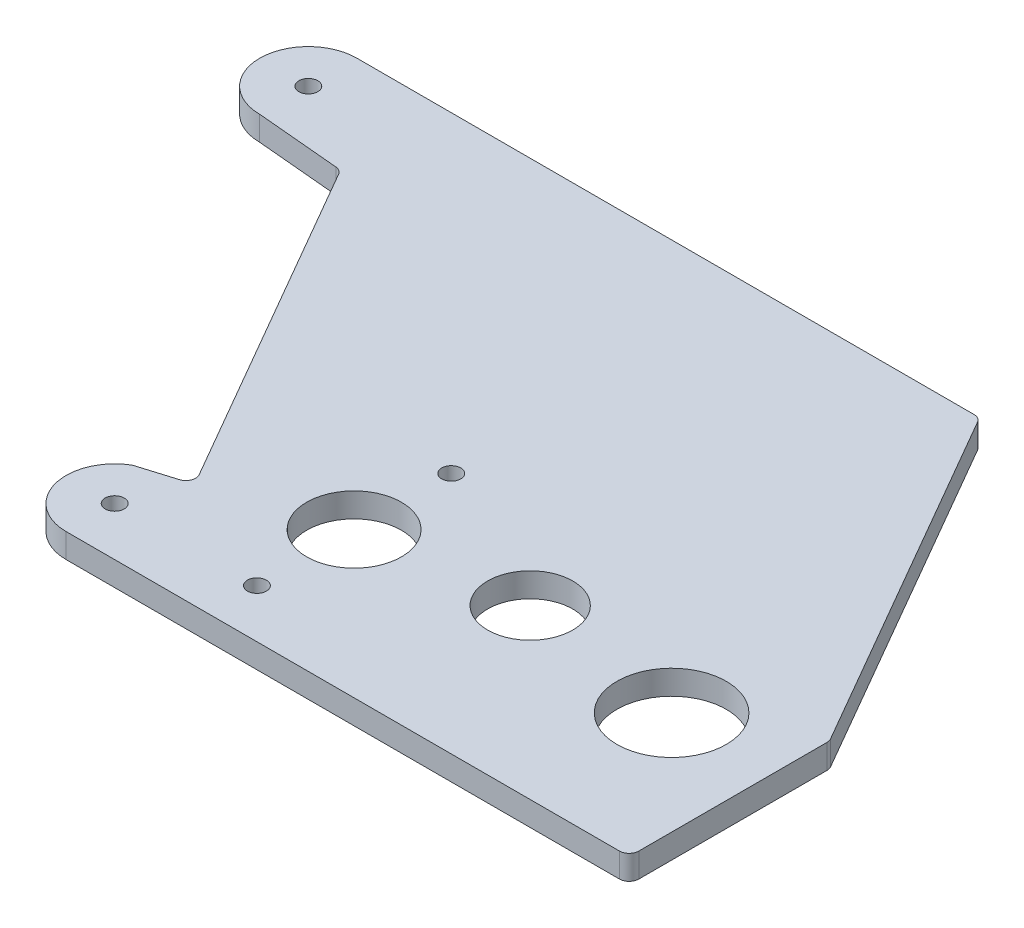
ISO-10303-21;
HEADER;
FILE_DESCRIPTION(('STEP AP214'),'2;1');
FILE_NAME('part.step','',(''),(''),'','','');
FILE_SCHEMA(('AUTOMOTIVE_DESIGN { 1 0 10303 214 1 1 1 1 }'));
ENDSEC;
DATA;
#1=APPLICATION_CONTEXT('core data for automotive mechanical design processes');
#2=APPLICATION_PROTOCOL_DEFINITION('international standard','automotive_design',2000,#1);
#3=PRODUCT_CONTEXT('',#1,'mechanical');
#4=PRODUCT('Part','Part','',(#3));
#5=PRODUCT_RELATED_PRODUCT_CATEGORY('part','',(#4));
#6=PRODUCT_DEFINITION_FORMATION('','',#4);
#7=PRODUCT_DEFINITION_CONTEXT('part definition',#1,'design');
#8=PRODUCT_DEFINITION('design','',#6,#7);
#9=PRODUCT_DEFINITION_SHAPE('','',#8);
#10=(LENGTH_UNIT() NAMED_UNIT(*) SI_UNIT(.MILLI.,.METRE.));
#11=(NAMED_UNIT(*) PLANE_ANGLE_UNIT() SI_UNIT($,.RADIAN.));
#12=(NAMED_UNIT(*) SI_UNIT($,.STERADIAN.) SOLID_ANGLE_UNIT());
#13=UNCERTAINTY_MEASURE_WITH_UNIT(LENGTH_MEASURE(1.E-05),#10,'distance_accuracy_value','');
#14=(GEOMETRIC_REPRESENTATION_CONTEXT(3) GLOBAL_UNCERTAINTY_ASSIGNED_CONTEXT((#13)) GLOBAL_UNIT_ASSIGNED_CONTEXT((#10,
#11,#12)) REPRESENTATION_CONTEXT('',''));
#15=CARTESIAN_POINT('',(0.,0.,0.));
#16=DIRECTION('',(0.,0.,1.));
#17=DIRECTION('',(1.,0.,0.));
#18=AXIS2_PLACEMENT_3D('',#15,#16,#17);
#19=CARTESIAN_POINT('',(4.6315098989881,6.35,15.2100282546714));
#20=DIRECTION('',(-0.291298086746578,0.,-0.956632335151694));
#21=DIRECTION('',(-0.956632335151694,0.,0.291298086746578));
#22=AXIS2_PLACEMENT_3D('',#19,#20,#21);
#23=PLANE('',#22);
#24=DIRECTION('',(0.956632335151694,0.,-0.291298086746578));
#25=VECTOR('',#24,1.);
#26=CARTESIAN_POINT('',(4.6315098989881,6.35,15.2100282546714));
#27=LINE('',#26,#25);
#28=CARTESIAN_POINT('',(-105.982617669633,6.35,48.8924395049369));
#29=VERTEX_POINT('',#28);
#30=CARTESIAN_POINT('',(-96.5688292217659,6.35,46.0259060801956));
#31=VERTEX_POINT('',#30);
#32=EDGE_CURVE('E141',#29,#31,#27,.T.);
#33=ORIENTED_EDGE('',*,*,#32,.T.);
#34=DIRECTION('',(0.,-1.,0.));
#35=VECTOR('',#34,1.);
#36=CARTESIAN_POINT('',(-96.5688292217659,6.35,46.0259060801956));
#37=LINE('',#36,#35);
#38=CARTESIAN_POINT('',(-96.5688292217659,0.,46.0259060801956));
#39=VERTEX_POINT('',#38);
#40=EDGE_CURVE('E280',#31,#39,#37,.T.);
#41=ORIENTED_EDGE('',*,*,#40,.T.);
#42=DIRECTION('',(0.956632335151694,0.,-0.291298086746578));
#43=VECTOR('',#42,1.);
#44=CARTESIAN_POINT('',(4.6315098989881,0.,15.2100282546714));
#45=LINE('',#44,#43);
#46=CARTESIAN_POINT('',(-105.982617669633,0.,48.8924395049369));
#47=VERTEX_POINT('',#46);
#48=EDGE_CURVE('E144',#47,#39,#45,.T.);
#49=ORIENTED_EDGE('',*,*,#48,.F.);
#50=DIRECTION('',(0.,-1.,0.));
#51=VECTOR('',#50,1.);
#52=CARTESIAN_POINT('',(-105.982617669633,6.35,48.8924395049369));
#53=LINE('',#52,#51);
#54=EDGE_CURVE('E138',#29,#47,#53,.T.);
#55=ORIENTED_EDGE('',*,*,#54,.F.);
#56=EDGE_LOOP('',(#33,#41,#49,#55));
#57=FACE_BOUND('',#56,.T.);
#58=ADVANCED_FACE('F37',(#57),#23,.T.);
#59=CARTESIAN_POINT('',(-99.6326176696326,6.35,59.8909621329995));
#60=DIRECTION('',(0.,-1.,0.));
#61=DIRECTION('',(0.,0.,-1.));
#62=AXIS2_PLACEMENT_3D('',#59,#60,#61);
#63=CYLINDRICAL_SURFACE('',#62,12.6999999999998);
#64=CARTESIAN_POINT('',(-99.6326176696326,0.,59.8909621329995));
#65=DIRECTION('',(0.,1.,0.));
#66=DIRECTION('',(0.,0.,1.));
#67=AXIS2_PLACEMENT_3D('',#64,#65,#66);
#68=CIRCLE('',#67,12.6999999999998);
#69=CARTESIAN_POINT('',(-99.6326176696326,0.,72.5909621329996));
#70=VERTEX_POINT('',#69);
#71=EDGE_CURVE('E207',#47,#70,#68,.T.);
#72=ORIENTED_EDGE('',*,*,#71,.T.);
#73=DIRECTION('',(0.,-1.,0.));
#74=VECTOR('',#73,1.);
#75=CARTESIAN_POINT('',(-99.6326176696326,6.35,72.5909621329996));
#76=LINE('',#75,#74);
#77=CARTESIAN_POINT('',(-99.6326176696326,6.35,72.5909621329996));
#78=VERTEX_POINT('',#77);
#79=EDGE_CURVE('E149',#78,#70,#76,.T.);
#80=ORIENTED_EDGE('',*,*,#79,.F.);
#81=CARTESIAN_POINT('',(-99.6326176696326,6.35,59.8909621329995));
#82=DIRECTION('',(0.,1.,0.));
#83=DIRECTION('',(0.,0.,1.));
#84=AXIS2_PLACEMENT_3D('',#81,#82,#83);
#85=CIRCLE('',#84,12.6999999999998);
#86=EDGE_CURVE('E153',#29,#78,#85,.T.);
#87=ORIENTED_EDGE('',*,*,#86,.F.);
#88=ORIENTED_EDGE('',*,*,#54,.T.);
#89=EDGE_LOOP('',(#72,#80,#87,#88));
#90=FACE_BOUND('',#89,.T.);
#91=ADVANCED_FACE('F154',(#90),#63,.T.);
#92=CARTESIAN_POINT('',(0.,6.35,72.590962133));
#93=DIRECTION('',(0.,0.,-1.));
#94=DIRECTION('',(-1.,0.,0.));
#95=AXIS2_PLACEMENT_3D('',#92,#93,#94);
#96=PLANE('',#95);
#97=DIRECTION('',(1.,0.,0.));
#98=VECTOR('',#97,1.);
#99=CARTESIAN_POINT('',(0.,0.,72.590962133));
#100=LINE('',#99,#98);
#101=CARTESIAN_POINT('',(45.0244535100556,0.,72.590962133));
#102=VERTEX_POINT('',#101);
#103=EDGE_CURVE('E209',#70,#102,#100,.T.);
#104=ORIENTED_EDGE('',*,*,#103,.T.);
#105=DIRECTION('',(0.,-1.,0.));
#106=VECTOR('',#105,1.);
#107=CARTESIAN_POINT('',(45.0244535100556,6.35,72.590962133));
#108=LINE('',#107,#106);
#109=CARTESIAN_POINT('',(45.0244535100556,6.35,72.590962133));
#110=VERTEX_POINT('',#109);
#111=EDGE_CURVE('E259',#102,#110,#108,.F.);
#112=ORIENTED_EDGE('',*,*,#111,.T.);
#113=DIRECTION('',(1.,0.,0.));
#114=VECTOR('',#113,1.);
#115=CARTESIAN_POINT('',(0.,6.35,72.590962133));
#116=LINE('',#115,#114);
#117=EDGE_CURVE('E157',#78,#110,#116,.T.);
#118=ORIENTED_EDGE('',*,*,#117,.F.);
#119=ORIENTED_EDGE('',*,*,#79,.T.);
#120=EDGE_LOOP('',(#104,#112,#118,#119));
#121=FACE_BOUND('',#120,.T.);
#122=ADVANCED_FACE('F306',(#121),#96,.F.);
#123=CARTESIAN_POINT('',(47.5644535100556,6.35,0.));
#124=DIRECTION('',(1.,0.,0.));
#125=DIRECTION('',(0.,0.,-1.));
#126=AXIS2_PLACEMENT_3D('',#123,#124,#125);
#127=PLANE('',#126);
#128=DIRECTION('',(0.,0.,1.));
#129=VECTOR('',#128,1.);
#130=CARTESIAN_POINT('',(47.5644535100556,6.35,0.));
#131=LINE('',#130,#129);
#132=CARTESIAN_POINT('',(47.5644535100556,6.35,20.871353081775));
#133=VERTEX_POINT('',#132);
#134=CARTESIAN_POINT('',(47.5644535100556,6.35,70.050962133));
#135=VERTEX_POINT('',#134);
#136=EDGE_CURVE('E169',#133,#135,#131,.T.);
#137=ORIENTED_EDGE('',*,*,#136,.T.);
#138=DIRECTION('',(0.,-1.,0.));
#139=VECTOR('',#138,1.);
#140=CARTESIAN_POINT('',(47.5644535100556,0.,70.050962133));
#141=LINE('',#140,#139);
#142=CARTESIAN_POINT('',(47.5644535100556,0.,70.050962133));
#143=VERTEX_POINT('',#142);
#144=EDGE_CURVE('E250',#135,#143,#141,.T.);
#145=ORIENTED_EDGE('',*,*,#144,.T.);
#146=DIRECTION('',(0.,0.,1.));
#147=VECTOR('',#146,1.);
#148=CARTESIAN_POINT('',(47.5644535100556,0.,0.));
#149=LINE('',#148,#147);
#150=CARTESIAN_POINT('',(47.5644535100556,0.,20.871353081775));
#151=VERTEX_POINT('',#150);
#152=EDGE_CURVE('E212',#151,#143,#149,.T.);
#153=ORIENTED_EDGE('',*,*,#152,.F.);
#154=DIRECTION('',(0.,1.,0.));
#155=VECTOR('',#154,1.);
#156=CARTESIAN_POINT('',(47.5644535100556,6.35,20.871353081775));
#157=LINE('',#156,#155);
#158=EDGE_CURVE('E148',#151,#133,#157,.T.);
#159=ORIENTED_EDGE('',*,*,#158,.T.);
#160=EDGE_LOOP('',(#137,#145,#153,#159));
#161=FACE_BOUND('',#160,.T.);
#162=ADVANCED_FACE('F345',(#161),#127,.T.);
#163=CARTESIAN_POINT('',(0.,6.35,-72.590962133));
#164=DIRECTION('',(0.,0.,-1.));
#165=DIRECTION('',(-1.,0.,0.));
#166=AXIS2_PLACEMENT_3D('',#163,#164,#165);
#167=PLANE('',#166);
#168=DIRECTION('',(1.,0.,0.));
#169=VECTOR('',#168,1.);
#170=CARTESIAN_POINT('',(0.,6.35,-72.590962133));
#171=LINE('',#170,#169);
#172=CARTESIAN_POINT('',(-168.788743888658,6.35,-72.5909621329999));
#173=VERTEX_POINT('',#172);
#174=CARTESIAN_POINT('',(-7.46956965453877,6.35,-72.590962133));
#175=VERTEX_POINT('',#174);
#176=EDGE_CURVE('E172',#173,#175,#171,.T.);
#177=ORIENTED_EDGE('',*,*,#176,.T.);
#178=DIRECTION('',(0.,1.,0.));
#179=VECTOR('',#178,1.);
#180=CARTESIAN_POINT('',(-7.46956965453877,0.,-72.590962133));
#181=LINE('',#180,#179);
#182=CARTESIAN_POINT('',(-7.46956965453877,0.,-72.590962133));
#183=VERTEX_POINT('',#182);
#184=EDGE_CURVE('E272',#175,#183,#181,.F.);
#185=ORIENTED_EDGE('',*,*,#184,.T.);
#186=DIRECTION('',(1.,0.,0.));
#187=VECTOR('',#186,1.);
#188=CARTESIAN_POINT('',(0.,0.,-72.590962133));
#189=LINE('',#188,#187);
#190=CARTESIAN_POINT('',(-168.788743888658,0.,-72.5909621329999));
#191=VERTEX_POINT('',#190);
#192=EDGE_CURVE('E215',#191,#183,#189,.T.);
#193=ORIENTED_EDGE('',*,*,#192,.F.);
#194=DIRECTION('',(0.,-1.,0.));
#195=VECTOR('',#194,1.);
#196=CARTESIAN_POINT('',(-168.788743888658,6.35,-72.5909621329999));
#197=LINE('',#196,#195);
#198=EDGE_CURVE('E245',#173,#191,#197,.T.);
#199=ORIENTED_EDGE('',*,*,#198,.F.);
#200=EDGE_LOOP('',(#177,#185,#193,#199));
#201=FACE_BOUND('',#200,.T.);
#202=ADVANCED_FACE('F354',(#201),#167,.T.);
#203=CARTESIAN_POINT('',(-168.788743888658,6.35,-59.890962133));
#204=DIRECTION('',(0.,-1.,0.));
#205=DIRECTION('',(0.,0.,-1.));
#206=AXIS2_PLACEMENT_3D('',#203,#204,#205);
#207=CYLINDRICAL_SURFACE('',#206,12.6999999999998);
#208=CARTESIAN_POINT('',(-168.788743888658,0.,-59.890962133));
#209=DIRECTION('',(0.,1.,0.));
#210=DIRECTION('',(0.,0.,1.));
#211=AXIS2_PLACEMENT_3D('',#208,#209,#210);
#212=CIRCLE('',#211,12.6999999999998);
#213=CARTESIAN_POINT('',(-168.788743865941,0.,-47.1909621330002));
#214=VERTEX_POINT('',#213);
#215=EDGE_CURVE('E218',#191,#214,#212,.T.);
#216=ORIENTED_EDGE('',*,*,#215,.T.);
#217=DIRECTION('',(0.,-1.,0.));
#218=VECTOR('',#217,1.);
#219=CARTESIAN_POINT('',(-168.788743865941,6.35,-47.1909621330002));
#220=LINE('',#219,#218);
#221=CARTESIAN_POINT('',(-168.788743865941,6.35,-47.1909621330002));
#222=VERTEX_POINT('',#221);
#223=EDGE_CURVE('E201',#222,#214,#220,.T.);
#224=ORIENTED_EDGE('',*,*,#223,.F.);
#225=CARTESIAN_POINT('',(-168.788743888658,6.35,-59.890962133));
#226=DIRECTION('',(0.,1.,0.));
#227=DIRECTION('',(0.,0.,1.));
#228=AXIS2_PLACEMENT_3D('',#225,#226,#227);
#229=CIRCLE('',#228,12.6999999999998);
#230=EDGE_CURVE('E175',#173,#222,#229,.T.);
#231=ORIENTED_EDGE('',*,*,#230,.F.);
#232=ORIENTED_EDGE('',*,*,#198,.T.);
#233=EDGE_LOOP('',(#216,#224,#231,#232));
#234=FACE_BOUND('',#233,.T.);
#235=ADVANCED_FACE('F359',(#234),#207,.T.);
#236=CARTESIAN_POINT('',(2.86216329422665,6.35,-31.6858333990643));
#237=DIRECTION('',(0.0899631534478361,0.,-0.995945094381071));
#238=DIRECTION('',(-0.995945094381071,0.,-0.0899631534478361));
#239=AXIS2_PLACEMENT_3D('',#236,#237,#238);
#240=PLANE('',#239);
#241=DIRECTION('',(0.995945094381071,0.,0.0899631534478361));
#242=VECTOR('',#241,1.);
#243=CARTESIAN_POINT('',(2.86216329422665,0.,-31.6858333990643));
#244=LINE('',#243,#242);
#245=CARTESIAN_POINT('',(-146.893746505368,0.,-45.2131994848361));
#246=VERTEX_POINT('',#245);
#247=EDGE_CURVE('E221',#214,#246,#244,.T.);
#248=ORIENTED_EDGE('',*,*,#247,.T.);
#249=DIRECTION('',(0.,-1.,0.));
#250=VECTOR('',#249,1.);
#251=CARTESIAN_POINT('',(-146.893746505368,6.35,-45.2131994848361));
#252=LINE('',#251,#250);
#253=CARTESIAN_POINT('',(-146.893746505368,6.35,-45.2131994848361));
#254=VERTEX_POINT('',#253);
#255=EDGE_CURVE('E278',#246,#254,#252,.F.);
#256=ORIENTED_EDGE('',*,*,#255,.T.);
#257=DIRECTION('',(0.995945094381071,0.,0.0899631534478361));
#258=VECTOR('',#257,1.);
#259=CARTESIAN_POINT('',(2.86216329422665,6.35,-31.6858333990643));
#260=LINE('',#259,#258);
#261=EDGE_CURVE('E178',#222,#254,#260,.T.);
#262=ORIENTED_EDGE('',*,*,#261,.F.);
#263=ORIENTED_EDGE('',*,*,#223,.T.);
#264=EDGE_LOOP('',(#248,#256,#262,#263));
#265=FACE_BOUND('',#264,.T.);
#266=ADVANCED_FACE('F363',(#265),#240,.F.);
#267=CARTESIAN_POINT('',(-168.788743888658,6.35,-59.890962133));
#268=DIRECTION('',(0.,-1.,0.));
#269=DIRECTION('',(0.,0.,-1.));
#270=AXIS2_PLACEMENT_3D('',#267,#268,#269);
#271=CYLINDRICAL_SURFACE('',#270,2.48920000000006);
#272=CARTESIAN_POINT('',(-168.788743888658,6.35,-59.890962133));
#273=DIRECTION('',(0.,1.,0.));
#274=DIRECTION('',(0.,0.,1.));
#275=AXIS2_PLACEMENT_3D('',#272,#273,#274);
#276=CIRCLE('',#275,2.48920000000006);
#277=CARTESIAN_POINT('',(-168.788743888658,6.35,-57.4017621329999));
#278=VERTEX_POINT('',#277);
#279=EDGE_CURVE('E195',#278,#278,#276,.T.);
#280=ORIENTED_EDGE('',*,*,#279,.T.);
#281=EDGE_LOOP('',(#280));
#282=FACE_BOUND('',#281,.T.);
#283=CARTESIAN_POINT('',(-168.788743888658,0.,-59.890962133));
#284=DIRECTION('',(0.,1.,0.));
#285=DIRECTION('',(0.,0.,1.));
#286=AXIS2_PLACEMENT_3D('',#283,#284,#285);
#287=CIRCLE('',#286,2.48920000000006);
#288=CARTESIAN_POINT('',(-168.788743888658,0.,-57.4017621329999));
#289=VERTEX_POINT('',#288);
#290=EDGE_CURVE('E238',#289,#289,#287,.T.);
#291=ORIENTED_EDGE('',*,*,#290,.F.);
#292=EDGE_LOOP('',(#291));
#293=FACE_BOUND('',#292,.T.);
#294=ADVANCED_FACE('F367',(#282,#293),#271,.F.);
#295=CARTESIAN_POINT('',(-62.4429464899444,6.35,34.490962133));
#296=DIRECTION('',(0.,-1.,0.));
#297=DIRECTION('',(0.,0.,-1.));
#298=AXIS2_PLACEMENT_3D('',#295,#296,#297);
#299=CYLINDRICAL_SURFACE('',#298,12.3825);
#300=CARTESIAN_POINT('',(-62.4429464899444,6.35,34.490962133));
#301=DIRECTION('',(0.,1.,0.));
#302=DIRECTION('',(0.,0.,1.));
#303=AXIS2_PLACEMENT_3D('',#300,#301,#302);
#304=CIRCLE('',#303,12.3825);
#305=CARTESIAN_POINT('',(-62.4429464899444,6.35,46.873462133));
#306=VERTEX_POINT('',#305);
#307=EDGE_CURVE('E192',#306,#306,#304,.T.);
#308=ORIENTED_EDGE('',*,*,#307,.T.);
#309=EDGE_LOOP('',(#308));
#310=FACE_BOUND('',#309,.T.);
#311=CARTESIAN_POINT('',(-62.4429464899444,0.,34.490962133));
#312=DIRECTION('',(0.,1.,0.));
#313=DIRECTION('',(0.,0.,1.));
#314=AXIS2_PLACEMENT_3D('',#311,#312,#313);
#315=CIRCLE('',#314,12.3825);
#316=CARTESIAN_POINT('',(-62.4429464899444,0.,46.873462133));
#317=VERTEX_POINT('',#316);
#318=EDGE_CURVE('E235',#317,#317,#315,.T.);
#319=ORIENTED_EDGE('',*,*,#318,.F.);
#320=EDGE_LOOP('',(#319));
#321=FACE_BOUND('',#320,.T.);
#322=ADVANCED_FACE('F382',(#310,#321),#299,.F.);
#323=CARTESIAN_POINT('',(-62.4429464899444,6.35,9.09096213299999));
#324=DIRECTION('',(0.,-1.,0.));
#325=DIRECTION('',(0.,0.,-1.));
#326=AXIS2_PLACEMENT_3D('',#323,#324,#325);
#327=CYLINDRICAL_SURFACE('',#326,2.4892);
#328=CARTESIAN_POINT('',(-62.4429464899444,6.35,9.09096213299999));
#329=DIRECTION('',(0.,1.,0.));
#330=DIRECTION('',(0.,0.,1.));
#331=AXIS2_PLACEMENT_3D('',#328,#329,#330);
#332=CIRCLE('',#331,2.4892);
#333=CARTESIAN_POINT('',(-62.4429464899444,6.35,11.580162133));
#334=VERTEX_POINT('',#333);
#335=EDGE_CURVE('E189',#334,#334,#332,.T.);
#336=ORIENTED_EDGE('',*,*,#335,.T.);
#337=EDGE_LOOP('',(#336));
#338=FACE_BOUND('',#337,.T.);
#339=CARTESIAN_POINT('',(-62.4429464899444,0.,9.09096213299999));
#340=DIRECTION('',(0.,1.,0.));
#341=DIRECTION('',(0.,0.,1.));
#342=AXIS2_PLACEMENT_3D('',#339,#340,#341);
#343=CIRCLE('',#342,2.4892);
#344=CARTESIAN_POINT('',(-62.4429464899444,0.,11.580162133));
#345=VERTEX_POINT('',#344);
#346=EDGE_CURVE('E232',#345,#345,#343,.T.);
#347=ORIENTED_EDGE('',*,*,#346,.F.);
#348=EDGE_LOOP('',(#347));
#349=FACE_BOUND('',#348,.T.);
#350=ADVANCED_FACE('F378',(#338,#349),#327,.F.);
#351=CARTESIAN_POINT('',(-62.4429464899444,6.35,59.890962133));
#352=DIRECTION('',(0.,-1.,0.));
#353=DIRECTION('',(0.,0.,-1.));
#354=AXIS2_PLACEMENT_3D('',#351,#352,#353);
#355=CYLINDRICAL_SURFACE('',#354,2.4892);
#356=CARTESIAN_POINT('',(-62.4429464899444,6.35,59.890962133));
#357=DIRECTION('',(0.,1.,0.));
#358=DIRECTION('',(0.,0.,1.));
#359=AXIS2_PLACEMENT_3D('',#356,#357,#358);
#360=CIRCLE('',#359,2.4892);
#361=CARTESIAN_POINT('',(-62.4429464899444,6.35,62.380162133));
#362=VERTEX_POINT('',#361);
#363=EDGE_CURVE('E186',#362,#362,#360,.T.);
#364=ORIENTED_EDGE('',*,*,#363,.T.);
#365=EDGE_LOOP('',(#364));
#366=FACE_BOUND('',#365,.T.);
#367=CARTESIAN_POINT('',(-62.4429464899444,0.,59.890962133));
#368=DIRECTION('',(0.,1.,0.));
#369=DIRECTION('',(0.,0.,1.));
#370=AXIS2_PLACEMENT_3D('',#367,#368,#369);
#371=CIRCLE('',#370,2.4892);
#372=CARTESIAN_POINT('',(-62.4429464899444,0.,62.380162133));
#373=VERTEX_POINT('',#372);
#374=EDGE_CURVE('E229',#373,#373,#371,.T.);
#375=ORIENTED_EDGE('',*,*,#374,.F.);
#376=EDGE_LOOP('',(#375));
#377=FACE_BOUND('',#376,.T.);
#378=ADVANCED_FACE('F374',(#366,#377),#355,.F.);
#379=CARTESIAN_POINT('',(20.5642535100556,6.35,34.490962133));
#380=DIRECTION('',(0.,-1.,0.));
#381=DIRECTION('',(0.,0.,-1.));
#382=AXIS2_PLACEMENT_3D('',#379,#380,#381);
#383=CYLINDRICAL_SURFACE('',#382,14.3002);
#384=CARTESIAN_POINT('',(20.5642535100556,6.35,34.490962133));
#385=DIRECTION('',(0.,1.,0.));
#386=DIRECTION('',(0.,0.,1.));
#387=AXIS2_PLACEMENT_3D('',#384,#385,#386);
#388=CIRCLE('',#387,14.3002);
#389=CARTESIAN_POINT('',(20.5642535100556,6.35,48.791162133));
#390=VERTEX_POINT('',#389);
#391=EDGE_CURVE('E183',#390,#390,#388,.T.);
#392=ORIENTED_EDGE('',*,*,#391,.T.);
#393=EDGE_LOOP('',(#392));
#394=FACE_BOUND('',#393,.T.);
#395=CARTESIAN_POINT('',(20.5642535100556,0.,34.490962133));
#396=DIRECTION('',(0.,1.,0.));
#397=DIRECTION('',(0.,0.,1.));
#398=AXIS2_PLACEMENT_3D('',#395,#396,#397);
#399=CIRCLE('',#398,14.3002);
#400=CARTESIAN_POINT('',(20.5642535100556,0.,48.791162133));
#401=VERTEX_POINT('',#400);
#402=EDGE_CURVE('E226',#401,#401,#399,.T.);
#403=ORIENTED_EDGE('',*,*,#402,.F.);
#404=EDGE_LOOP('',(#403));
#405=FACE_BOUND('',#404,.T.);
#406=ADVANCED_FACE('F371',(#394,#405),#383,.F.);
#407=CARTESIAN_POINT('',(-89.6594879562971,6.35,51.7649295069719));
#408=DIRECTION('',(0.86602540378444,0.,-0.499999999999998));
#409=DIRECTION('',(-0.499999999999998,0.,-0.86602540378444));
#410=AXIS2_PLACEMENT_3D('',#407,#408,#409);
#411=PLANE('',#410);
#412=DIRECTION('',(0.499999999999998,0.,0.86602540378444));
#413=VECTOR('',#412,1.);
#414=CARTESIAN_POINT('',(-89.6594879562971,6.35,51.7649295069719));
#415=LINE('',#414,#413);
#416=CARTESIAN_POINT('',(-144.922548389513,6.35,-43.9534989451082));
#417=VERTEX_POINT('',#416);
#418=CARTESIAN_POINT('',(-95.1090218364897,6.35,42.3260599489103));
#419=VERTEX_POINT('',#418);
#420=EDGE_CURVE('E181',#417,#419,#415,.T.);
#421=ORIENTED_EDGE('',*,*,#420,.F.);
#422=DIRECTION('',(0.,-1.,0.));
#423=VECTOR('',#422,1.);
#424=CARTESIAN_POINT('',(-144.922548389513,0.,-43.9534989451082));
#425=LINE('',#424,#423);
#426=CARTESIAN_POINT('',(-144.922548389513,0.,-43.9534989451082));
#427=VERTEX_POINT('',#426);
#428=EDGE_CURVE('E275',#417,#427,#425,.T.);
#429=ORIENTED_EDGE('',*,*,#428,.T.);
#430=DIRECTION('',(0.499999999999998,0.,0.86602540378444));
#431=VECTOR('',#430,1.);
#432=CARTESIAN_POINT('',(-89.6594879562971,0.,51.7649295069719));
#433=LINE('',#432,#431);
#434=CARTESIAN_POINT('',(-95.1090218364897,0.,42.3260599489103));
#435=VERTEX_POINT('',#434);
#436=EDGE_CURVE('E224',#427,#435,#433,.T.);
#437=ORIENTED_EDGE('',*,*,#436,.T.);
#438=DIRECTION('',(0.,-1.,0.));
#439=VECTOR('',#438,1.);
#440=CARTESIAN_POINT('',(-95.1090218364897,6.35,42.3260599489103));
#441=LINE('',#440,#439);
#442=EDGE_CURVE('E58',#435,#419,#441,.F.);
#443=ORIENTED_EDGE('',*,*,#442,.T.);
#444=EDGE_LOOP('',(#421,#429,#437,#443));
#445=FACE_BOUND('',#444,.T.);
#446=ADVANCED_FACE('F290',(#445),#411,.F.);
#447=CARTESIAN_POINT('',(-22.2217822304585,6.35,28.6713791916327));
#448=DIRECTION('',(0.,-1.,0.));
#449=DIRECTION('',(0.,0.,-1.));
#450=AXIS2_PLACEMENT_3D('',#447,#448,#449);
#451=CYLINDRICAL_SURFACE('',#450,11.1252);
#452=CARTESIAN_POINT('',(-22.2217822304585,6.35,28.6713791916327));
#453=DIRECTION('',(0.,1.,0.));
#454=DIRECTION('',(0.,0.,1.));
#455=AXIS2_PLACEMENT_3D('',#452,#453,#454);
#456=CIRCLE('',#455,11.1252);
#457=CARTESIAN_POINT('',(-22.2217822304585,6.35,39.7965791916327));
#458=VERTEX_POINT('',#457);
#459=EDGE_CURVE('E161',#458,#458,#456,.T.);
#460=ORIENTED_EDGE('',*,*,#459,.T.);
#461=EDGE_LOOP('',(#460));
#462=FACE_BOUND('',#461,.T.);
#463=CARTESIAN_POINT('',(-22.2217822304585,0.,28.6713791916327));
#464=DIRECTION('',(0.,1.,0.));
#465=DIRECTION('',(0.,0.,1.));
#466=AXIS2_PLACEMENT_3D('',#463,#464,#465);
#467=CIRCLE('',#466,11.1252);
#468=CARTESIAN_POINT('',(-22.2217822304585,0.,39.7965791916327));
#469=VERTEX_POINT('',#468);
#470=EDGE_CURVE('E202',#469,#469,#467,.T.);
#471=ORIENTED_EDGE('',*,*,#470,.F.);
#472=EDGE_LOOP('',(#471));
#473=FACE_BOUND('',#472,.T.);
#474=ADVANCED_FACE('F310',(#462,#473),#451,.F.);
#475=CARTESIAN_POINT('',(-99.6326176696326,6.35,59.8909621329995));
#476=DIRECTION('',(0.,-1.,0.));
#477=DIRECTION('',(0.,0.,-1.));
#478=AXIS2_PLACEMENT_3D('',#475,#476,#477);
#479=CYLINDRICAL_SURFACE('',#478,2.48920000000007);
#480=CARTESIAN_POINT('',(-99.6326176696326,6.35,59.8909621329995));
#481=DIRECTION('',(0.,1.,0.));
#482=DIRECTION('',(0.,0.,1.));
#483=AXIS2_PLACEMENT_3D('',#480,#481,#482);
#484=CIRCLE('',#483,2.48920000000007);
#485=CARTESIAN_POINT('',(-99.6326176696326,6.35,62.3801621329996));
#486=VERTEX_POINT('',#485);
#487=EDGE_CURVE('E198',#486,#486,#484,.T.);
#488=ORIENTED_EDGE('',*,*,#487,.T.);
#489=EDGE_LOOP('',(#488));
#490=FACE_BOUND('',#489,.T.);
#491=CARTESIAN_POINT('',(-99.6326176696326,0.,59.8909621329995));
#492=DIRECTION('',(0.,1.,0.));
#493=DIRECTION('',(0.,0.,1.));
#494=AXIS2_PLACEMENT_3D('',#491,#492,#493);
#495=CIRCLE('',#494,2.48920000000007);
#496=CARTESIAN_POINT('',(-99.6326176696326,0.,62.3801621329996));
#497=VERTEX_POINT('',#496);
#498=EDGE_CURVE('E164',#497,#497,#495,.T.);
#499=ORIENTED_EDGE('',*,*,#498,.F.);
#500=EDGE_LOOP('',(#499));
#501=FACE_BOUND('',#500,.T.);
#502=ADVANCED_FACE('F313',(#490,#501),#479,.F.);
#503=CARTESIAN_POINT('',(0.,6.35,0.));
#504=DIRECTION('',(0.,1.,0.));
#505=DIRECTION('',(0.,0.,1.));
#506=AXIS2_PLACEMENT_3D('',#503,#504,#505);
#507=PLANE('',#506);
#508=ORIENTED_EDGE('',*,*,#117,.T.);
#509=CARTESIAN_POINT('',(45.0244535100556,6.35,70.050962133));
#510=DIRECTION('',(0.,1.,0.));
#511=DIRECTION('',(0.,0.,1.));
#512=AXIS2_PLACEMENT_3D('',#509,#510,#511);
#513=CIRCLE('',#512,2.54);
#514=EDGE_CURVE('E265',#110,#135,#513,.T.);
#515=ORIENTED_EDGE('',*,*,#514,.T.);
#516=ORIENTED_EDGE('',*,*,#136,.F.);
#517=CARTESIAN_POINT('',(45.0244535100556,6.35,20.871353081775));
#518=DIRECTION('',(0.,1.,0.));
#519=DIRECTION('',(0.,0.,1.));
#520=AXIS2_PLACEMENT_3D('',#517,#518,#519);
#521=CIRCLE('',#520,2.54);
#522=CARTESIAN_POINT('',(47.2241580356681,6.35,19.601353081775));
#523=VERTEX_POINT('',#522);
#524=EDGE_CURVE('E263',#133,#523,#521,.T.);
#525=ORIENTED_EDGE('',*,*,#524,.T.);
#526=DIRECTION('',(0.5,0.,0.866025403784439));
#527=VECTOR('',#526,1.);
#528=CARTESIAN_POINT('',(47.5644535100556,6.35,20.190762133));
#529=LINE('',#528,#527);
#530=CARTESIAN_POINT('',(-5.26986512892631,6.35,-71.320962133));
#531=VERTEX_POINT('',#530);
#532=EDGE_CURVE('E340',#531,#523,#529,.T.);
#533=ORIENTED_EDGE('',*,*,#532,.F.);
#534=CARTESIAN_POINT('',(-7.46956965453877,6.35,-70.050962133));
#535=DIRECTION('',(0.,1.,0.));
#536=DIRECTION('',(0.,0.,1.));
#537=AXIS2_PLACEMENT_3D('',#534,#535,#536);
#538=CIRCLE('',#537,2.54);
#539=EDGE_CURVE('E261',#531,#175,#538,.T.);
#540=ORIENTED_EDGE('',*,*,#539,.T.);
#541=ORIENTED_EDGE('',*,*,#176,.F.);
#542=ORIENTED_EDGE('',*,*,#230,.T.);
#543=ORIENTED_EDGE('',*,*,#261,.T.);
#544=CARTESIAN_POINT('',(-147.122252915126,6.35,-42.6834989451082));
#545=DIRECTION('',(0.,1.,0.));
#546=DIRECTION('',(0.,0.,1.));
#547=AXIS2_PLACEMENT_3D('',#544,#545,#546);
#548=CIRCLE('',#547,2.54);
#549=EDGE_CURVE('E284',#254,#417,#548,.F.);
#550=ORIENTED_EDGE('',*,*,#549,.T.);
#551=ORIENTED_EDGE('',*,*,#420,.T.);
#552=CARTESIAN_POINT('',(-97.3087263621022,6.35,43.5960599489103));
#553=DIRECTION('',(0.,1.,0.));
#554=DIRECTION('',(0.,0.,1.));
#555=AXIS2_PLACEMENT_3D('',#552,#553,#554);
#556=CIRCLE('',#555,2.54);
#557=EDGE_CURVE('E11',#419,#31,#556,.F.);
#558=ORIENTED_EDGE('',*,*,#557,.T.);
#559=ORIENTED_EDGE('',*,*,#32,.F.);
#560=ORIENTED_EDGE('',*,*,#86,.T.);
#561=EDGE_LOOP('',(#508,#515,#516,#525,#533,#540,#541,#542,#543,#550,#551,#558,#559,#560));
#562=FACE_BOUND('',#561,.T.);
#563=ORIENTED_EDGE('',*,*,#459,.F.);
#564=EDGE_LOOP('',(#563));
#565=FACE_BOUND('',#564,.T.);
#566=ORIENTED_EDGE('',*,*,#391,.F.);
#567=EDGE_LOOP('',(#566));
#568=FACE_BOUND('',#567,.T.);
#569=ORIENTED_EDGE('',*,*,#363,.F.);
#570=EDGE_LOOP('',(#569));
#571=FACE_BOUND('',#570,.T.);
#572=ORIENTED_EDGE('',*,*,#335,.F.);
#573=EDGE_LOOP('',(#572));
#574=FACE_BOUND('',#573,.T.);
#575=ORIENTED_EDGE('',*,*,#307,.F.);
#576=EDGE_LOOP('',(#575));
#577=FACE_BOUND('',#576,.T.);
#578=ORIENTED_EDGE('',*,*,#279,.F.);
#579=EDGE_LOOP('',(#578));
#580=FACE_BOUND('',#579,.T.);
#581=ORIENTED_EDGE('',*,*,#487,.F.);
#582=EDGE_LOOP('',(#581));
#583=FACE_BOUND('',#582,.T.);
#584=ADVANCED_FACE('F159',(#562,#565,#568,#571,#574,#577,#580,#583),#507,.T.);
#585=CARTESIAN_POINT('',(0.,0.,0.));
#586=DIRECTION('',(0.,1.,0.));
#587=DIRECTION('',(0.,0.,1.));
#588=AXIS2_PLACEMENT_3D('',#585,#586,#587);
#589=PLANE('',#588);
#590=ORIENTED_EDGE('',*,*,#470,.T.);
#591=EDGE_LOOP('',(#590));
#592=FACE_BOUND('',#591,.T.);
#593=ORIENTED_EDGE('',*,*,#152,.T.);
#594=CARTESIAN_POINT('',(45.0244535100556,0.,70.050962133));
#595=DIRECTION('',(0.,1.,0.));
#596=DIRECTION('',(0.,0.,1.));
#597=AXIS2_PLACEMENT_3D('',#594,#595,#596);
#598=CIRCLE('',#597,2.54);
#599=EDGE_CURVE('E257',#143,#102,#598,.F.);
#600=ORIENTED_EDGE('',*,*,#599,.T.);
#601=ORIENTED_EDGE('',*,*,#103,.F.);
#602=ORIENTED_EDGE('',*,*,#71,.F.);
#603=ORIENTED_EDGE('',*,*,#48,.T.);
#604=CARTESIAN_POINT('',(-97.3087263621022,0.,43.5960599489103));
#605=DIRECTION('',(0.,1.,0.));
#606=DIRECTION('',(0.,0.,1.));
#607=AXIS2_PLACEMENT_3D('',#604,#605,#606);
#608=CIRCLE('',#607,2.54);
#609=EDGE_CURVE('E45',#39,#435,#608,.T.);
#610=ORIENTED_EDGE('',*,*,#609,.T.);
#611=ORIENTED_EDGE('',*,*,#436,.F.);
#612=CARTESIAN_POINT('',(-147.122252915126,0.,-42.6834989451082));
#613=DIRECTION('',(0.,1.,0.));
#614=DIRECTION('',(0.,0.,1.));
#615=AXIS2_PLACEMENT_3D('',#612,#613,#614);
#616=CIRCLE('',#615,2.54);
#617=EDGE_CURVE('E282',#427,#246,#616,.T.);
#618=ORIENTED_EDGE('',*,*,#617,.T.);
#619=ORIENTED_EDGE('',*,*,#247,.F.);
#620=ORIENTED_EDGE('',*,*,#215,.F.);
#621=ORIENTED_EDGE('',*,*,#192,.T.);
#622=CARTESIAN_POINT('',(-7.46956965453877,0.,-70.050962133));
#623=DIRECTION('',(0.,1.,0.));
#624=DIRECTION('',(0.,0.,1.));
#625=AXIS2_PLACEMENT_3D('',#622,#623,#624);
#626=CIRCLE('',#625,2.54);
#627=CARTESIAN_POINT('',(-5.26986512892631,0.,-71.320962133));
#628=VERTEX_POINT('',#627);
#629=EDGE_CURVE('E253',#183,#628,#626,.F.);
#630=ORIENTED_EDGE('',*,*,#629,.T.);
#631=DIRECTION('',(0.5,0.,0.866025403784439));
#632=VECTOR('',#631,1.);
#633=CARTESIAN_POINT('',(47.5644535100556,0.,20.190762133));
#634=LINE('',#633,#632);
#635=CARTESIAN_POINT('',(47.2241580356681,0.,19.601353081775));
#636=VERTEX_POINT('',#635);
#637=EDGE_CURVE('E205',#628,#636,#634,.T.);
#638=ORIENTED_EDGE('',*,*,#637,.T.);
#639=CARTESIAN_POINT('',(45.0244535100556,0.,20.871353081775));
#640=DIRECTION('',(0.,1.,0.));
#641=DIRECTION('',(0.,0.,1.));
#642=AXIS2_PLACEMENT_3D('',#639,#640,#641);
#643=CIRCLE('',#642,2.54);
#644=EDGE_CURVE('E255',#636,#151,#643,.F.);
#645=ORIENTED_EDGE('',*,*,#644,.T.);
#646=EDGE_LOOP('',(#593,#600,#601,#602,#603,#610,#611,#618,#619,#620,#621,#630,#638,#645));
#647=FACE_BOUND('',#646,.T.);
#648=ORIENTED_EDGE('',*,*,#402,.T.);
#649=EDGE_LOOP('',(#648));
#650=FACE_BOUND('',#649,.T.);
#651=ORIENTED_EDGE('',*,*,#374,.T.);
#652=EDGE_LOOP('',(#651));
#653=FACE_BOUND('',#652,.T.);
#654=ORIENTED_EDGE('',*,*,#346,.T.);
#655=EDGE_LOOP('',(#654));
#656=FACE_BOUND('',#655,.T.);
#657=ORIENTED_EDGE('',*,*,#318,.T.);
#658=EDGE_LOOP('',(#657));
#659=FACE_BOUND('',#658,.T.);
#660=ORIENTED_EDGE('',*,*,#290,.T.);
#661=EDGE_LOOP('',(#660));
#662=FACE_BOUND('',#661,.T.);
#663=ORIENTED_EDGE('',*,*,#498,.T.);
#664=EDGE_LOOP('',(#663));
#665=FACE_BOUND('',#664,.T.);
#666=ADVANCED_FACE('F287',(#592,#647,#650,#653,#656,#659,#662,#665),#589,.F.);
#667=CARTESIAN_POINT('',(47.5644535100556,0.,20.190762133));
#668=DIRECTION('',(-0.866025403784439,0.,0.5));
#669=DIRECTION('',(0.5,0.,0.866025403784439));
#670=AXIS2_PLACEMENT_3D('',#667,#668,#669);
#671=PLANE('',#670);
#672=ORIENTED_EDGE('',*,*,#532,.T.);
#673=DIRECTION('',(0.,1.,0.));
#674=VECTOR('',#673,1.);
#675=CARTESIAN_POINT('',(47.2241580356681,0.,19.601353081775));
#676=LINE('',#675,#674);
#677=EDGE_CURVE('E270',#523,#636,#676,.F.);
#678=ORIENTED_EDGE('',*,*,#677,.T.);
#679=ORIENTED_EDGE('',*,*,#637,.F.);
#680=DIRECTION('',(0.,1.,0.));
#681=VECTOR('',#680,1.);
#682=CARTESIAN_POINT('',(-5.2698651289263,6.35,-71.320962133));
#683=LINE('',#682,#681);
#684=EDGE_CURVE('E267',#628,#531,#683,.T.);
#685=ORIENTED_EDGE('',*,*,#684,.T.);
#686=EDGE_LOOP('',(#672,#678,#679,#685));
#687=FACE_BOUND('',#686,.T.);
#688=ADVANCED_FACE('F319',(#687),#671,.F.);
#689=CARTESIAN_POINT('',(45.0244535100556,6.35,70.050962133));
#690=DIRECTION('',(0.,1.,0.));
#691=DIRECTION('',(0.,0.,1.));
#692=AXIS2_PLACEMENT_3D('',#689,#690,#691);
#693=CYLINDRICAL_SURFACE('',#692,2.54);
#694=ORIENTED_EDGE('',*,*,#514,.F.);
#695=ORIENTED_EDGE('',*,*,#111,.F.);
#696=ORIENTED_EDGE('',*,*,#599,.F.);
#697=ORIENTED_EDGE('',*,*,#144,.F.);
#698=EDGE_LOOP('',(#694,#695,#696,#697));
#699=FACE_BOUND('',#698,.T.);
#700=ADVANCED_FACE('F315',(#699),#693,.T.);
#701=CARTESIAN_POINT('',(45.0244535100556,6.35,20.871353081775));
#702=DIRECTION('',(0.,-1.,0.));
#703=DIRECTION('',(0.,0.,-1.));
#704=AXIS2_PLACEMENT_3D('',#701,#702,#703);
#705=CYLINDRICAL_SURFACE('',#704,2.54);
#706=ORIENTED_EDGE('',*,*,#644,.F.);
#707=ORIENTED_EDGE('',*,*,#677,.F.);
#708=ORIENTED_EDGE('',*,*,#524,.F.);
#709=ORIENTED_EDGE('',*,*,#158,.F.);
#710=EDGE_LOOP('',(#706,#707,#708,#709));
#711=FACE_BOUND('',#710,.T.);
#712=ADVANCED_FACE('F318',(#711),#705,.T.);
#713=CARTESIAN_POINT('',(-7.46956965453877,0.,-70.050962133));
#714=DIRECTION('',(0.,-1.,0.));
#715=DIRECTION('',(0.,0.,-1.));
#716=AXIS2_PLACEMENT_3D('',#713,#714,#715);
#717=CYLINDRICAL_SURFACE('',#716,2.54);
#718=ORIENTED_EDGE('',*,*,#629,.F.);
#719=ORIENTED_EDGE('',*,*,#184,.F.);
#720=ORIENTED_EDGE('',*,*,#539,.F.);
#721=ORIENTED_EDGE('',*,*,#684,.F.);
#722=EDGE_LOOP('',(#718,#719,#720,#721));
#723=FACE_BOUND('',#722,.T.);
#724=ADVANCED_FACE('F297',(#723),#717,.T.);
#725=CARTESIAN_POINT('',(-147.122252915126,6.35,-42.6834989451082));
#726=DIRECTION('',(0.,1.,0.));
#727=DIRECTION('',(0.,0.,1.));
#728=AXIS2_PLACEMENT_3D('',#725,#726,#727);
#729=CYLINDRICAL_SURFACE('',#728,2.54);
#730=ORIENTED_EDGE('',*,*,#549,.F.);
#731=ORIENTED_EDGE('',*,*,#255,.F.);
#732=ORIENTED_EDGE('',*,*,#617,.F.);
#733=ORIENTED_EDGE('',*,*,#428,.F.);
#734=EDGE_LOOP('',(#730,#731,#732,#733));
#735=FACE_BOUND('',#734,.T.);
#736=ADVANCED_FACE('F293',(#735),#729,.F.);
#737=CARTESIAN_POINT('',(-97.3087263621022,6.35,43.5960599489103));
#738=DIRECTION('',(0.,-1.,0.));
#739=DIRECTION('',(0.,0.,-1.));
#740=AXIS2_PLACEMENT_3D('',#737,#738,#739);
#741=CYLINDRICAL_SURFACE('',#740,2.54);
#742=ORIENTED_EDGE('',*,*,#557,.F.);
#743=ORIENTED_EDGE('',*,*,#442,.F.);
#744=ORIENTED_EDGE('',*,*,#609,.F.);
#745=ORIENTED_EDGE('',*,*,#40,.F.);
#746=EDGE_LOOP('',(#742,#743,#744,#745));
#747=FACE_BOUND('',#746,.T.);
#748=ADVANCED_FACE('F39',(#747),#741,.F.);
#749=CLOSED_SHELL('',(#58,#91,#122,#162,#202,#235,#266,#294,#322,#350,#378,#406,#446,#474,#502,
#584,#666,#688,#700,#712,#724,#736,#748));
#750=MANIFOLD_SOLID_BREP('B2',#749);
#751=ADVANCED_BREP_SHAPE_REPRESENTATION('',(#18,#750),#14);
#752=SHAPE_DEFINITION_REPRESENTATION(#9,#751);
ENDSEC;
END-ISO-10303-21;
